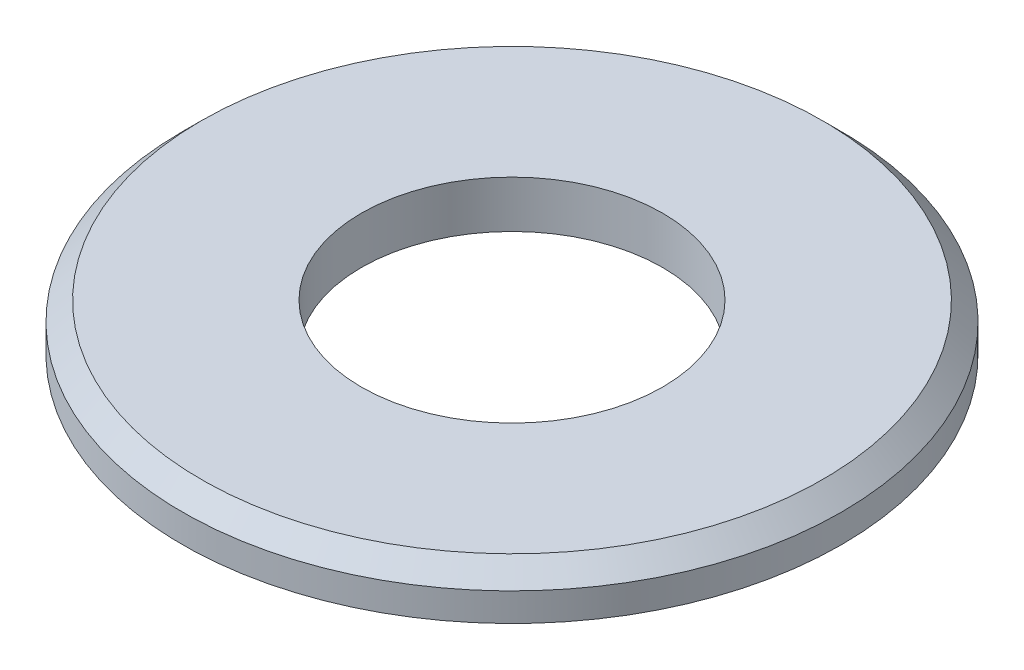
ISO-10303-21;
HEADER;
FILE_DESCRIPTION(('STEP AP214'),'2;1');
FILE_NAME('part.step','',(''),(''),'','','');
FILE_SCHEMA(('AUTOMOTIVE_DESIGN { 1 0 10303 214 1 1 1 1 }'));
ENDSEC;
DATA;
#1=APPLICATION_CONTEXT('core data for automotive mechanical design processes');
#2=APPLICATION_PROTOCOL_DEFINITION('international standard','automotive_design',2000,#1);
#3=PRODUCT_CONTEXT('',#1,'mechanical');
#4=PRODUCT('Part','Part','',(#3));
#5=PRODUCT_RELATED_PRODUCT_CATEGORY('part','',(#4));
#6=PRODUCT_DEFINITION_FORMATION('','',#4);
#7=PRODUCT_DEFINITION_CONTEXT('part definition',#1,'design');
#8=PRODUCT_DEFINITION('design','',#6,#7);
#9=PRODUCT_DEFINITION_SHAPE('','',#8);
#10=(LENGTH_UNIT() NAMED_UNIT(*) SI_UNIT(.MILLI.,.METRE.));
#11=(NAMED_UNIT(*) PLANE_ANGLE_UNIT() SI_UNIT($,.RADIAN.));
#12=(NAMED_UNIT(*) SI_UNIT($,.STERADIAN.) SOLID_ANGLE_UNIT());
#13=UNCERTAINTY_MEASURE_WITH_UNIT(LENGTH_MEASURE(1.E-05),#10,'distance_accuracy_value','');
#14=(GEOMETRIC_REPRESENTATION_CONTEXT(3) GLOBAL_UNCERTAINTY_ASSIGNED_CONTEXT((#13)) GLOBAL_UNIT_ASSIGNED_CONTEXT((#10,
#11,#12)) REPRESENTATION_CONTEXT('',''));
#15=CARTESIAN_POINT('',(0.,0.,0.));
#16=DIRECTION('',(0.,0.,1.));
#17=DIRECTION('',(1.,0.,0.));
#18=AXIS2_PLACEMENT_3D('',#15,#16,#17);
#19=CARTESIAN_POINT('',(0.,9.99571370251288,0.));
#20=DIRECTION('',(0.,-1.,0.));
#21=DIRECTION('',(1.,0.,0.));
#22=AXIS2_PLACEMENT_3D('',#19,#20,#21);
#23=CONICAL_SURFACE('',#22,3.5,0.785398163397449);
#24=CARTESIAN_POINT('',(0.,10.1957137025129,0.));
#25=DIRECTION('',(0.,1.,0.));
#26=DIRECTION('',(-1.,0.,0.));
#27=AXIS2_PLACEMENT_3D('',#24,#25,#26);
#28=CIRCLE('',#27,3.3);
#29=CARTESIAN_POINT('',(-3.3,10.1957137025129,0.));
#30=VERTEX_POINT('',#29);
#31=EDGE_CURVE('E47',#30,#30,#28,.T.);
#32=ORIENTED_EDGE('',*,*,#31,.F.);
#33=EDGE_LOOP('',(#32));
#34=FACE_BOUND('',#33,.T.);
#35=CARTESIAN_POINT('',(0.,9.99571370251288,0.));
#36=DIRECTION('',(0.,1.,0.));
#37=DIRECTION('',(-1.,0.,0.));
#38=AXIS2_PLACEMENT_3D('',#35,#36,#37);
#39=CIRCLE('',#38,3.5);
#40=CARTESIAN_POINT('',(-3.5,9.99571370251288,0.));
#41=VERTEX_POINT('',#40);
#42=EDGE_CURVE('E10',#41,#41,#39,.T.);
#43=ORIENTED_EDGE('',*,*,#42,.T.);
#44=EDGE_LOOP('',(#43));
#45=FACE_BOUND('',#44,.T.);
#46=ADVANCED_FACE('F37',(#34,#45),#23,.T.);
#47=CARTESIAN_POINT('',(0.,10.1957137025129,0.));
#48=DIRECTION('',(0.,1.,0.));
#49=DIRECTION('',(-1.,0.,0.));
#50=AXIS2_PLACEMENT_3D('',#47,#48,#49);
#51=CYLINDRICAL_SURFACE('',#50,3.5);
#52=ORIENTED_EDGE('',*,*,#42,.F.);
#53=EDGE_LOOP('',(#52));
#54=FACE_BOUND('',#53,.T.);
#55=CARTESIAN_POINT('',(0.,9.69571370251288,0.));
#56=DIRECTION('',(0.,1.,0.));
#57=DIRECTION('',(-1.,0.,0.));
#58=AXIS2_PLACEMENT_3D('',#55,#56,#57);
#59=CIRCLE('',#58,3.5);
#60=CARTESIAN_POINT('',(-3.5,9.69571370251288,0.));
#61=VERTEX_POINT('',#60);
#62=EDGE_CURVE('E43',#61,#61,#59,.T.);
#63=ORIENTED_EDGE('',*,*,#62,.T.);
#64=EDGE_LOOP('',(#63));
#65=FACE_BOUND('',#64,.T.);
#66=ADVANCED_FACE('F76',(#54,#65),#51,.T.);
#67=CARTESIAN_POINT('',(0.,9.69571370251288,0.));
#68=DIRECTION('',(0.,1.,0.));
#69=DIRECTION('',(-1.,0.,0.));
#70=AXIS2_PLACEMENT_3D('',#67,#68,#69);
#71=PLANE('',#70);
#72=CARTESIAN_POINT('',(0.,9.69571370251287,0.));
#73=DIRECTION('',(0.,1.,0.));
#74=DIRECTION('',(-1.,0.,0.));
#75=AXIS2_PLACEMENT_3D('',#72,#73,#74);
#76=CIRCLE('',#75,1.6);
#77=CARTESIAN_POINT('',(-1.6,9.69571370251287,0.));
#78=VERTEX_POINT('',#77);
#79=EDGE_CURVE('E51',#78,#78,#76,.T.);
#80=ORIENTED_EDGE('',*,*,#79,.T.);
#81=EDGE_LOOP('',(#80));
#82=FACE_BOUND('',#81,.T.);
#83=ORIENTED_EDGE('',*,*,#62,.F.);
#84=EDGE_LOOP('',(#83));
#85=FACE_BOUND('',#84,.T.);
#86=ADVANCED_FACE('F60',(#82,#85),#71,.F.);
#87=CARTESIAN_POINT('',(0.,10.1957137025129,0.));
#88=DIRECTION('',(0.,-1.,0.));
#89=DIRECTION('',(1.,0.,0.));
#90=AXIS2_PLACEMENT_3D('',#87,#88,#89);
#91=PLANE('',#90);
#92=CARTESIAN_POINT('',(0.,10.1957137025129,0.));
#93=DIRECTION('',(0.,1.,0.));
#94=DIRECTION('',(-1.,0.,0.));
#95=AXIS2_PLACEMENT_3D('',#92,#93,#94);
#96=CIRCLE('',#95,1.6);
#97=CARTESIAN_POINT('',(-1.6,10.1957137025129,0.));
#98=VERTEX_POINT('',#97);
#99=EDGE_CURVE('E54',#98,#98,#96,.T.);
#100=ORIENTED_EDGE('',*,*,#99,.F.);
#101=EDGE_LOOP('',(#100));
#102=FACE_BOUND('',#101,.T.);
#103=ORIENTED_EDGE('',*,*,#31,.T.);
#104=EDGE_LOOP('',(#103));
#105=FACE_BOUND('',#104,.T.);
#106=ADVANCED_FACE('F66',(#102,#105),#91,.F.);
#107=CARTESIAN_POINT('',(0.,9.69571370251287,0.));
#108=DIRECTION('',(0.,1.,0.));
#109=DIRECTION('',(-1.,0.,0.));
#110=AXIS2_PLACEMENT_3D('',#107,#108,#109);
#111=CYLINDRICAL_SURFACE('',#110,1.6);
#112=ORIENTED_EDGE('',*,*,#79,.F.);
#113=EDGE_LOOP('',(#112));
#114=FACE_BOUND('',#113,.T.);
#115=ORIENTED_EDGE('',*,*,#99,.T.);
#116=EDGE_LOOP('',(#115));
#117=FACE_BOUND('',#116,.T.);
#118=ADVANCED_FACE('F63',(#114,#117),#111,.F.);
#119=CLOSED_SHELL('',(#46,#66,#86,#106,#118));
#120=MANIFOLD_SOLID_BREP('B2',#119);
#121=ADVANCED_BREP_SHAPE_REPRESENTATION('',(#18,#120),#14);
#122=SHAPE_DEFINITION_REPRESENTATION(#9,#121);
ENDSEC;
END-ISO-10303-21;
